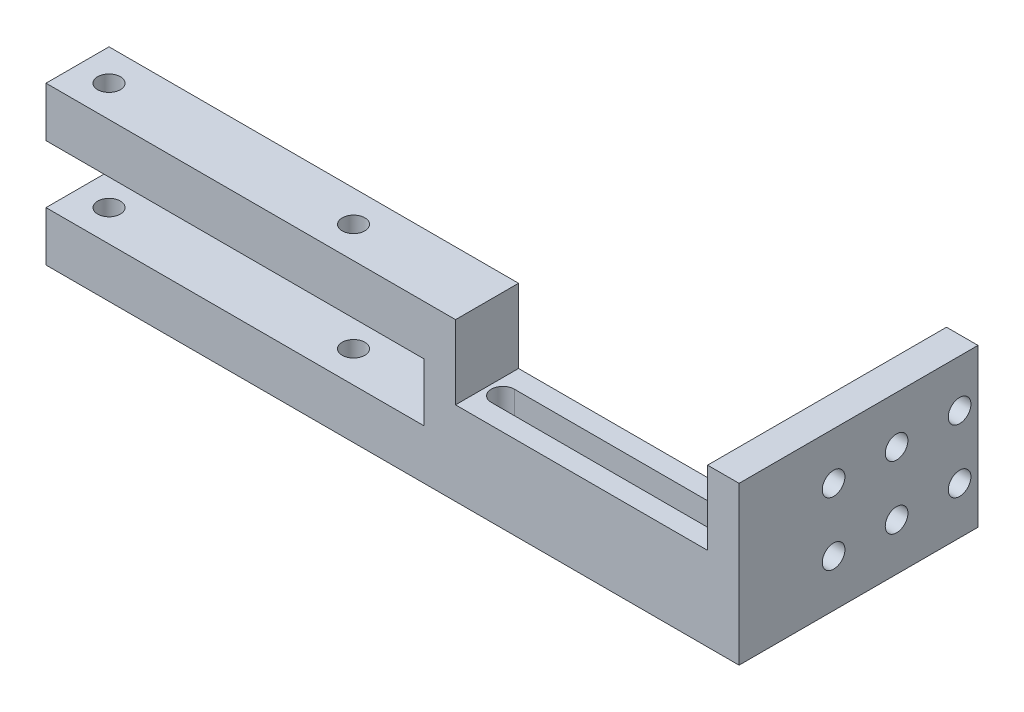
ISO-10303-21;
HEADER;
FILE_DESCRIPTION(('STEP AP214'),'2;1');
FILE_NAME('part.step','',(''),(''),'','','');
FILE_SCHEMA(('AUTOMOTIVE_DESIGN { 1 0 10303 214 1 1 1 1 }'));
ENDSEC;
DATA;
#1=APPLICATION_CONTEXT('core data for automotive mechanical design processes');
#2=APPLICATION_PROTOCOL_DEFINITION('international standard','automotive_design',2000,#1);
#3=PRODUCT_CONTEXT('',#1,'mechanical');
#4=PRODUCT('Part','Part','',(#3));
#5=PRODUCT_RELATED_PRODUCT_CATEGORY('part','',(#4));
#6=PRODUCT_DEFINITION_FORMATION('','',#4);
#7=PRODUCT_DEFINITION_CONTEXT('part definition',#1,'design');
#8=PRODUCT_DEFINITION('design','',#6,#7);
#9=PRODUCT_DEFINITION_SHAPE('','',#8);
#10=(LENGTH_UNIT() NAMED_UNIT(*) SI_UNIT(.MILLI.,.METRE.));
#11=(NAMED_UNIT(*) PLANE_ANGLE_UNIT() SI_UNIT($,.RADIAN.));
#12=(NAMED_UNIT(*) SI_UNIT($,.STERADIAN.) SOLID_ANGLE_UNIT());
#13=UNCERTAINTY_MEASURE_WITH_UNIT(LENGTH_MEASURE(1.E-05),#10,'distance_accuracy_value','');
#14=(GEOMETRIC_REPRESENTATION_CONTEXT(3) GLOBAL_UNCERTAINTY_ASSIGNED_CONTEXT((#13)) GLOBAL_UNIT_ASSIGNED_CONTEXT((#10,
#11,#12)) REPRESENTATION_CONTEXT('',''));
#15=CARTESIAN_POINT('',(0.,0.,0.));
#16=DIRECTION('',(0.,0.,1.));
#17=DIRECTION('',(1.,0.,0.));
#18=AXIS2_PLACEMENT_3D('',#15,#16,#17);
#19=CARTESIAN_POINT('',(0.,25.,0.));
#20=DIRECTION('',(0.,1.,0.));
#21=DIRECTION('',(0.,0.,1.));
#22=AXIS2_PLACEMENT_3D('',#19,#20,#21);
#23=PLANE('',#22);
#24=DIRECTION('',(0.,0.,1.));
#25=VECTOR('',#24,1.);
#26=CARTESIAN_POINT('',(105.,25.,-20.));
#27=LINE('',#26,#25);
#28=CARTESIAN_POINT('',(105.,25.,-37.9214797311));
#29=VERTEX_POINT('',#28);
#30=CARTESIAN_POINT('',(105.,25.,0.));
#31=VERTEX_POINT('',#30);
#32=EDGE_CURVE('E258',#29,#31,#27,.T.);
#33=ORIENTED_EDGE('',*,*,#32,.T.);
#34=DIRECTION('',(1.,0.,0.));
#35=VECTOR('',#34,1.);
#36=CARTESIAN_POINT('',(0.,25.,0.));
#37=LINE('',#36,#35);
#38=CARTESIAN_POINT('',(110.,25.,0.));
#39=VERTEX_POINT('',#38);
#40=EDGE_CURVE('E367',#31,#39,#37,.T.);
#41=ORIENTED_EDGE('',*,*,#40,.T.);
#42=DIRECTION('',(0.,0.,1.));
#43=VECTOR('',#42,1.);
#44=CARTESIAN_POINT('',(110.,25.,0.));
#45=LINE('',#44,#43);
#46=CARTESIAN_POINT('',(110.,25.,-37.9214797311));
#47=VERTEX_POINT('',#46);
#48=EDGE_CURVE('E331',#47,#39,#45,.T.);
#49=ORIENTED_EDGE('',*,*,#48,.F.);
#50=DIRECTION('',(1.,0.,0.));
#51=VECTOR('',#50,1.);
#52=CARTESIAN_POINT('',(0.,25.,-37.9214797311));
#53=LINE('',#52,#51);
#54=EDGE_CURVE('E214',#29,#47,#53,.T.);
#55=ORIENTED_EDGE('',*,*,#54,.F.);
#56=EDGE_LOOP('',(#33,#41,#49,#55));
#57=FACE_BOUND('',#56,.T.);
#58=ADVANCED_FACE('F34',(#57),#23,.T.);
#59=CARTESIAN_POINT('',(0.,25.,0.));
#60=DIRECTION('',(1.,0.,0.));
#61=DIRECTION('',(0.,0.,-1.));
#62=AXIS2_PLACEMENT_3D('',#59,#60,#61);
#63=PLANE('',#62);
#64=DIRECTION('',(0.,-1.,0.));
#65=VECTOR('',#64,1.);
#66=CARTESIAN_POINT('',(0.,25.,-10.));
#67=LINE('',#66,#65);
#68=CARTESIAN_POINT('',(0.,25.,-10.));
#69=VERTEX_POINT('',#68);
#70=CARTESIAN_POINT('',(0.,17.1,-10.));
#71=VERTEX_POINT('',#70);
#72=EDGE_CURVE('E11',#69,#71,#67,.T.);
#73=ORIENTED_EDGE('',*,*,#72,.T.);
#74=DIRECTION('',(0.,0.,-1.));
#75=VECTOR('',#74,1.);
#76=CARTESIAN_POINT('',(0.,17.1,-10.));
#77=LINE('',#76,#75);
#78=CARTESIAN_POINT('',(0.,17.1,0.));
#79=VERTEX_POINT('',#78);
#80=EDGE_CURVE('E374',#79,#71,#77,.T.);
#81=ORIENTED_EDGE('',*,*,#80,.F.);
#82=DIRECTION('',(0.,-1.,0.));
#83=VECTOR('',#82,1.);
#84=CARTESIAN_POINT('',(0.,25.,0.));
#85=LINE('',#84,#83);
#86=CARTESIAN_POINT('',(0.,25.,0.));
#87=VERTEX_POINT('',#86);
#88=EDGE_CURVE('E345',#87,#79,#85,.T.);
#89=ORIENTED_EDGE('',*,*,#88,.F.);
#90=DIRECTION('',(0.,0.,1.));
#91=VECTOR('',#90,1.);
#92=CARTESIAN_POINT('',(0.,25.,0.));
#93=LINE('',#92,#91);
#94=EDGE_CURVE('E342',#69,#87,#93,.T.);
#95=ORIENTED_EDGE('',*,*,#94,.F.);
#96=EDGE_LOOP('',(#73,#81,#89,#95));
#97=FACE_BOUND('',#96,.T.);
#98=ADVANCED_FACE('F290',(#97),#63,.F.);
#99=CARTESIAN_POINT('',(5.,25.,-5.));
#100=DIRECTION('',(0.,-1.,0.));
#101=DIRECTION('',(0.,0.,-1.));
#102=AXIS2_PLACEMENT_3D('',#99,#100,#101);
#103=CYLINDRICAL_SURFACE('',#102,1.8);
#104=CARTESIAN_POINT('',(5.,17.1,-5.));
#105=DIRECTION('',(0.,1.,0.));
#106=DIRECTION('',(0.,0.,1.));
#107=AXIS2_PLACEMENT_3D('',#104,#105,#106);
#108=CIRCLE('',#107,1.8);
#109=CARTESIAN_POINT('',(5.,17.1,-3.2));
#110=VERTEX_POINT('',#109);
#111=EDGE_CURVE('E366',#110,#110,#108,.T.);
#112=ORIENTED_EDGE('',*,*,#111,.F.);
#113=EDGE_LOOP('',(#112));
#114=FACE_BOUND('',#113,.T.);
#115=CARTESIAN_POINT('',(5.,25.,-5.));
#116=DIRECTION('',(0.,1.,0.));
#117=DIRECTION('',(0.,0.,1.));
#118=AXIS2_PLACEMENT_3D('',#115,#116,#117);
#119=CIRCLE('',#118,1.8);
#120=CARTESIAN_POINT('',(5.,25.,-3.2));
#121=VERTEX_POINT('',#120);
#122=EDGE_CURVE('E329',#121,#121,#119,.T.);
#123=ORIENTED_EDGE('',*,*,#122,.T.);
#124=EDGE_LOOP('',(#123));
#125=FACE_BOUND('',#124,.T.);
#126=ADVANCED_FACE('F299',(#114,#125),#103,.F.);
#127=CARTESIAN_POINT('',(43.81,25.,-5.));
#128=DIRECTION('',(0.,-1.,0.));
#129=DIRECTION('',(0.,0.,-1.));
#130=AXIS2_PLACEMENT_3D('',#127,#128,#129);
#131=CYLINDRICAL_SURFACE('',#130,1.8);
#132=CARTESIAN_POINT('',(43.81,17.1,-5.));
#133=DIRECTION('',(0.,1.,0.));
#134=DIRECTION('',(0.,0.,1.));
#135=AXIS2_PLACEMENT_3D('',#132,#133,#134);
#136=CIRCLE('',#135,1.8);
#137=CARTESIAN_POINT('',(43.81,17.1,-3.2));
#138=VERTEX_POINT('',#137);
#139=EDGE_CURVE('E412',#138,#138,#136,.T.);
#140=ORIENTED_EDGE('',*,*,#139,.F.);
#141=EDGE_LOOP('',(#140));
#142=FACE_BOUND('',#141,.T.);
#143=CARTESIAN_POINT('',(43.81,25.,-5.));
#144=DIRECTION('',(0.,1.,0.));
#145=DIRECTION('',(0.,0.,1.));
#146=AXIS2_PLACEMENT_3D('',#143,#144,#145);
#147=CIRCLE('',#146,1.8);
#148=CARTESIAN_POINT('',(43.81,25.,-3.2));
#149=VERTEX_POINT('',#148);
#150=EDGE_CURVE('E326',#149,#149,#147,.T.);
#151=ORIENTED_EDGE('',*,*,#150,.T.);
#152=EDGE_LOOP('',(#151));
#153=FACE_BOUND('',#152,.T.);
#154=ADVANCED_FACE('F420',(#142,#153),#131,.F.);
#155=CARTESIAN_POINT('',(110.,25.,0.));
#156=DIRECTION('',(1.,0.,0.));
#157=DIRECTION('',(0.,0.,-1.));
#158=AXIS2_PLACEMENT_3D('',#155,#156,#157);
#159=PLANE('',#158);
#160=DIRECTION('',(0.,-1.,0.));
#161=VECTOR('',#160,1.);
#162=CARTESIAN_POINT('',(110.,46.,-37.9214797311));
#163=LINE('',#162,#161);
#164=CARTESIAN_POINT('',(110.,0.,-37.9214797311));
#165=VERTEX_POINT('',#164);
#166=EDGE_CURVE('E210',#47,#165,#163,.T.);
#167=ORIENTED_EDGE('',*,*,#166,.F.);
#168=ORIENTED_EDGE('',*,*,#48,.T.);
#169=DIRECTION('',(0.,-1.,0.));
#170=VECTOR('',#169,1.);
#171=CARTESIAN_POINT('',(110.,25.,0.));
#172=LINE('',#171,#170);
#173=CARTESIAN_POINT('',(110.,0.,0.));
#174=VERTEX_POINT('',#173);
#175=EDGE_CURVE('E349',#39,#174,#172,.T.);
#176=ORIENTED_EDGE('',*,*,#175,.T.);
#177=DIRECTION('',(0.,0.,1.));
#178=VECTOR('',#177,1.);
#179=CARTESIAN_POINT('',(110.,0.,0.));
#180=LINE('',#179,#178);
#181=EDGE_CURVE('E359',#165,#174,#180,.T.);
#182=ORIENTED_EDGE('',*,*,#181,.F.);
#183=EDGE_LOOP('',(#167,#168,#176,#182));
#184=FACE_BOUND('',#183,.T.);
#185=CARTESIAN_POINT('',(110.,7.5,-25.));
#186=DIRECTION('',(1.,0.,0.));
#187=DIRECTION('',(0.,0.,-1.));
#188=AXIS2_PLACEMENT_3D('',#185,#186,#187);
#189=CIRCLE('',#188,1.8);
#190=CARTESIAN_POINT('',(110.,7.5,-26.8));
#191=VERTEX_POINT('',#190);
#192=EDGE_CURVE('E220',#191,#191,#189,.T.);
#193=ORIENTED_EDGE('',*,*,#192,.F.);
#194=EDGE_LOOP('',(#193));
#195=FACE_BOUND('',#194,.T.);
#196=CARTESIAN_POINT('',(110.,17.5,-25.));
#197=DIRECTION('',(1.,0.,0.));
#198=DIRECTION('',(0.,0.,-1.));
#199=AXIS2_PLACEMENT_3D('',#196,#197,#198);
#200=CIRCLE('',#199,1.8);
#201=CARTESIAN_POINT('',(110.,17.5,-26.8));
#202=VERTEX_POINT('',#201);
#203=EDGE_CURVE('E226',#202,#202,#200,.T.);
#204=ORIENTED_EDGE('',*,*,#203,.F.);
#205=EDGE_LOOP('',(#204));
#206=FACE_BOUND('',#205,.T.);
#207=CARTESIAN_POINT('',(110.,7.5,-35.));
#208=DIRECTION('',(1.,0.,0.));
#209=DIRECTION('',(0.,0.,-1.));
#210=AXIS2_PLACEMENT_3D('',#207,#208,#209);
#211=CIRCLE('',#210,1.8);
#212=CARTESIAN_POINT('',(110.,7.5,-36.8));
#213=VERTEX_POINT('',#212);
#214=EDGE_CURVE('E232',#213,#213,#211,.T.);
#215=ORIENTED_EDGE('',*,*,#214,.F.);
#216=EDGE_LOOP('',(#215));
#217=FACE_BOUND('',#216,.T.);
#218=CARTESIAN_POINT('',(110.,17.5,-35.));
#219=DIRECTION('',(1.,0.,0.));
#220=DIRECTION('',(0.,0.,-1.));
#221=AXIS2_PLACEMENT_3D('',#218,#219,#220);
#222=CIRCLE('',#221,1.8);
#223=CARTESIAN_POINT('',(110.,17.5,-36.8));
#224=VERTEX_POINT('',#223);
#225=EDGE_CURVE('E238',#224,#224,#222,.T.);
#226=ORIENTED_EDGE('',*,*,#225,.F.);
#227=EDGE_LOOP('',(#226));
#228=FACE_BOUND('',#227,.T.);
#229=CARTESIAN_POINT('',(110.,17.5,-15.));
#230=DIRECTION('',(1.,0.,0.));
#231=DIRECTION('',(0.,0.,-1.));
#232=AXIS2_PLACEMENT_3D('',#229,#230,#231);
#233=CIRCLE('',#232,1.8);
#234=CARTESIAN_POINT('',(110.,17.5,-16.8));
#235=VERTEX_POINT('',#234);
#236=EDGE_CURVE('E241',#235,#235,#233,.T.);
#237=ORIENTED_EDGE('',*,*,#236,.F.);
#238=EDGE_LOOP('',(#237));
#239=FACE_BOUND('',#238,.T.);
#240=CARTESIAN_POINT('',(110.,7.5,-15.));
#241=DIRECTION('',(1.,0.,0.));
#242=DIRECTION('',(0.,0.,-1.));
#243=AXIS2_PLACEMENT_3D('',#240,#241,#242);
#244=CIRCLE('',#243,1.8);
#245=CARTESIAN_POINT('',(110.,7.5,-16.8));
#246=VERTEX_POINT('',#245);
#247=EDGE_CURVE('E245',#246,#246,#244,.T.);
#248=ORIENTED_EDGE('',*,*,#247,.F.);
#249=EDGE_LOOP('',(#248));
#250=FACE_BOUND('',#249,.T.);
#251=ADVANCED_FACE('F425',(#184,#195,#206,#217,#228,#239,#250),#159,.T.);
#252=CARTESIAN_POINT('',(0.,25.,-10.));
#253=DIRECTION('',(0.,0.,-1.));
#254=DIRECTION('',(-1.,0.,0.));
#255=AXIS2_PLACEMENT_3D('',#252,#253,#254);
#256=PLANE('',#255);
#257=DIRECTION('',(0.,1.,0.));
#258=VECTOR('',#257,1.);
#259=CARTESIAN_POINT('',(65.,13.285,-9.99999999999999));
#260=LINE('',#259,#258);
#261=CARTESIAN_POINT('',(65.,13.285,-9.99999999999999));
#262=VERTEX_POINT('',#261);
#263=CARTESIAN_POINT('',(65.,25.,-9.99999999999999));
#264=VERTEX_POINT('',#263);
#265=EDGE_CURVE('E199',#262,#264,#260,.T.);
#266=ORIENTED_EDGE('',*,*,#265,.F.);
#267=DIRECTION('',(-1.,0.,0.));
#268=VECTOR('',#267,1.);
#269=CARTESIAN_POINT('',(105.,13.285,-10.));
#270=LINE('',#269,#268);
#271=CARTESIAN_POINT('',(105.,13.285,-10.));
#272=VERTEX_POINT('',#271);
#273=EDGE_CURVE('E190',#272,#262,#270,.T.);
#274=ORIENTED_EDGE('',*,*,#273,.F.);
#275=DIRECTION('',(0.,1.,0.));
#276=VECTOR('',#275,1.);
#277=CARTESIAN_POINT('',(105.,0.,-10.));
#278=LINE('',#277,#276);
#279=CARTESIAN_POINT('',(105.,0.,-10.));
#280=VERTEX_POINT('',#279);
#281=EDGE_CURVE('E254',#280,#272,#278,.T.);
#282=ORIENTED_EDGE('',*,*,#281,.F.);
#283=DIRECTION('',(1.,0.,0.));
#284=VECTOR('',#283,1.);
#285=CARTESIAN_POINT('',(0.,0.,-10.));
#286=LINE('',#285,#284);
#287=CARTESIAN_POINT('',(0.,0.,-10.));
#288=VERTEX_POINT('',#287);
#289=EDGE_CURVE('E259',#288,#280,#286,.T.);
#290=ORIENTED_EDGE('',*,*,#289,.F.);
#291=CARTESIAN_POINT('',(0.,7.9,-10.));
#292=VERTEX_POINT('',#291);
#293=EDGE_CURVE('E44',#292,#288,#67,.T.);
#294=ORIENTED_EDGE('',*,*,#293,.F.);
#295=DIRECTION('',(-1.,0.,0.));
#296=VECTOR('',#295,1.);
#297=CARTESIAN_POINT('',(60.,7.9,-10.));
#298=LINE('',#297,#296);
#299=CARTESIAN_POINT('',(60.,7.9,-10.));
#300=VERTEX_POINT('',#299);
#301=EDGE_CURVE('E407',#300,#292,#298,.T.);
#302=ORIENTED_EDGE('',*,*,#301,.F.);
#303=DIRECTION('',(0.,-1.,0.));
#304=VECTOR('',#303,1.);
#305=CARTESIAN_POINT('',(60.,7.9,-10.));
#306=LINE('',#305,#304);
#307=CARTESIAN_POINT('',(60.,17.1,-10.));
#308=VERTEX_POINT('',#307);
#309=EDGE_CURVE('E251',#308,#300,#306,.T.);
#310=ORIENTED_EDGE('',*,*,#309,.F.);
#311=DIRECTION('',(-1.,0.,0.));
#312=VECTOR('',#311,1.);
#313=CARTESIAN_POINT('',(60.,17.1,-10.));
#314=LINE('',#313,#312);
#315=EDGE_CURVE('E389',#308,#71,#314,.T.);
#316=ORIENTED_EDGE('',*,*,#315,.T.);
#317=ORIENTED_EDGE('',*,*,#72,.F.);
#318=DIRECTION('',(1.,0.,0.));
#319=VECTOR('',#318,1.);
#320=CARTESIAN_POINT('',(0.,25.,-10.));
#321=LINE('',#320,#319);
#322=EDGE_CURVE('E334',#69,#264,#321,.T.);
#323=ORIENTED_EDGE('',*,*,#322,.T.);
#324=EDGE_LOOP('',(#266,#274,#282,#290,#294,#302,#310,#316,#317,#323));
#325=FACE_BOUND('',#324,.T.);
#326=ADVANCED_FACE('F386',(#325),#256,.T.);
#327=CARTESIAN_POINT('',(0.,7.9,0.));
#328=VERTEX_POINT('',#327);
#329=CARTESIAN_POINT('',(0.,0.,0.));
#330=VERTEX_POINT('',#329);
#331=EDGE_CURVE('E348',#328,#330,#85,.T.);
#332=ORIENTED_EDGE('',*,*,#331,.F.);
#333=DIRECTION('',(0.,0.,1.));
#334=VECTOR('',#333,1.);
#335=CARTESIAN_POINT('',(0.,7.9,-10.));
#336=LINE('',#335,#334);
#337=EDGE_CURVE('E447',#292,#328,#336,.T.);
#338=ORIENTED_EDGE('',*,*,#337,.F.);
#339=ORIENTED_EDGE('',*,*,#293,.T.);
#340=DIRECTION('',(0.,0.,1.));
#341=VECTOR('',#340,1.);
#342=CARTESIAN_POINT('',(0.,0.,0.));
#343=LINE('',#342,#341);
#344=EDGE_CURVE('E355',#288,#330,#343,.T.);
#345=ORIENTED_EDGE('',*,*,#344,.T.);
#346=EDGE_LOOP('',(#332,#338,#339,#345));
#347=FACE_BOUND('',#346,.T.);
#348=ADVANCED_FACE('F302',(#347),#63,.F.);
#349=CARTESIAN_POINT('',(5.,7.9,-5.));
#350=DIRECTION('',(0.,-1.,0.));
#351=DIRECTION('',(0.,0.,-1.));
#352=AXIS2_PLACEMENT_3D('',#349,#350,#351);
#353=CIRCLE('',#352,1.8);
#354=CARTESIAN_POINT('',(5.,7.9,-6.8));
#355=VERTEX_POINT('',#354);
#356=EDGE_CURVE('E398',#355,#355,#353,.T.);
#357=ORIENTED_EDGE('',*,*,#356,.F.);
#358=EDGE_LOOP('',(#357));
#359=FACE_BOUND('',#358,.T.);
#360=CARTESIAN_POINT('',(5.,0.,-5.));
#361=DIRECTION('',(0.,1.,0.));
#362=DIRECTION('',(0.,0.,1.));
#363=AXIS2_PLACEMENT_3D('',#360,#361,#362);
#364=CIRCLE('',#363,1.8);
#365=CARTESIAN_POINT('',(5.,0.,-3.2));
#366=VERTEX_POINT('',#365);
#367=EDGE_CURVE('E361',#366,#366,#364,.T.);
#368=ORIENTED_EDGE('',*,*,#367,.F.);
#369=EDGE_LOOP('',(#368));
#370=FACE_BOUND('',#369,.T.);
#371=ADVANCED_FACE('F421',(#359,#370),#103,.F.);
#372=CARTESIAN_POINT('',(43.81,7.9,-5.));
#373=DIRECTION('',(0.,-1.,0.));
#374=DIRECTION('',(0.,0.,-1.));
#375=AXIS2_PLACEMENT_3D('',#372,#373,#374);
#376=CIRCLE('',#375,1.8);
#377=CARTESIAN_POINT('',(43.81,7.9,-6.8));
#378=VERTEX_POINT('',#377);
#379=EDGE_CURVE('E395',#378,#378,#376,.T.);
#380=ORIENTED_EDGE('',*,*,#379,.F.);
#381=EDGE_LOOP('',(#380));
#382=FACE_BOUND('',#381,.T.);
#383=CARTESIAN_POINT('',(43.81,0.,-5.));
#384=DIRECTION('',(0.,1.,0.));
#385=DIRECTION('',(0.,0.,1.));
#386=AXIS2_PLACEMENT_3D('',#383,#384,#385);
#387=CIRCLE('',#386,1.8);
#388=CARTESIAN_POINT('',(43.81,0.,-3.2));
#389=VERTEX_POINT('',#388);
#390=EDGE_CURVE('E364',#389,#389,#387,.T.);
#391=ORIENTED_EDGE('',*,*,#390,.F.);
#392=EDGE_LOOP('',(#391));
#393=FACE_BOUND('',#392,.T.);
#394=ADVANCED_FACE('F36',(#382,#393),#131,.F.);
#395=CARTESIAN_POINT('',(0.,25.,0.));
#396=DIRECTION('',(0.,0.,-1.));
#397=DIRECTION('',(-1.,0.,0.));
#398=AXIS2_PLACEMENT_3D('',#395,#396,#397);
#399=PLANE('',#398);
#400=ORIENTED_EDGE('',*,*,#40,.F.);
#401=DIRECTION('',(0.,1.,0.));
#402=VECTOR('',#401,1.);
#403=CARTESIAN_POINT('',(105.,13.285,0.));
#404=LINE('',#403,#402);
#405=CARTESIAN_POINT('',(105.,13.285,0.));
#406=VERTEX_POINT('',#405);
#407=EDGE_CURVE('E201',#406,#31,#404,.T.);
#408=ORIENTED_EDGE('',*,*,#407,.F.);
#409=DIRECTION('',(1.,0.,0.));
#410=VECTOR('',#409,1.);
#411=CARTESIAN_POINT('',(105.,13.285,0.));
#412=LINE('',#411,#410);
#413=CARTESIAN_POINT('',(65.,13.285,0.));
#414=VERTEX_POINT('',#413);
#415=EDGE_CURVE('E196',#414,#406,#412,.T.);
#416=ORIENTED_EDGE('',*,*,#415,.F.);
#417=DIRECTION('',(0.,1.,0.));
#418=VECTOR('',#417,1.);
#419=CARTESIAN_POINT('',(65.,13.285,0.));
#420=LINE('',#419,#418);
#421=CARTESIAN_POINT('',(65.,25.,0.));
#422=VERTEX_POINT('',#421);
#423=EDGE_CURVE('E205',#414,#422,#420,.T.);
#424=ORIENTED_EDGE('',*,*,#423,.T.);
#425=EDGE_CURVE('E352',#87,#422,#37,.T.);
#426=ORIENTED_EDGE('',*,*,#425,.F.);
#427=ORIENTED_EDGE('',*,*,#88,.T.);
#428=DIRECTION('',(-1.,0.,0.));
#429=VECTOR('',#428,1.);
#430=CARTESIAN_POINT('',(60.,17.1,0.));
#431=LINE('',#430,#429);
#432=CARTESIAN_POINT('',(60.,17.1,0.));
#433=VERTEX_POINT('',#432);
#434=EDGE_CURVE('E377',#433,#79,#431,.T.);
#435=ORIENTED_EDGE('',*,*,#434,.F.);
#436=DIRECTION('',(0.,1.,0.));
#437=VECTOR('',#436,1.);
#438=CARTESIAN_POINT('',(60.,7.9,0.));
#439=LINE('',#438,#437);
#440=CARTESIAN_POINT('',(60.,7.9,0.));
#441=VERTEX_POINT('',#440);
#442=EDGE_CURVE('E453',#441,#433,#439,.T.);
#443=ORIENTED_EDGE('',*,*,#442,.F.);
#444=DIRECTION('',(-1.,0.,0.));
#445=VECTOR('',#444,1.);
#446=CARTESIAN_POINT('',(60.,7.9,0.));
#447=LINE('',#446,#445);
#448=EDGE_CURVE('E400',#441,#328,#447,.T.);
#449=ORIENTED_EDGE('',*,*,#448,.T.);
#450=ORIENTED_EDGE('',*,*,#331,.T.);
#451=DIRECTION('',(1.,0.,0.));
#452=VECTOR('',#451,1.);
#453=CARTESIAN_POINT('',(0.,0.,0.));
#454=LINE('',#453,#452);
#455=EDGE_CURVE('E336',#330,#174,#454,.T.);
#456=ORIENTED_EDGE('',*,*,#455,.T.);
#457=ORIENTED_EDGE('',*,*,#175,.F.);
#458=EDGE_LOOP('',(#400,#408,#416,#424,#426,#427,#435,#443,#449,#450,#456,#457));
#459=FACE_BOUND('',#458,.T.);
#460=ADVANCED_FACE('F307',(#459),#399,.F.);
#461=DIRECTION('',(0.,0.,1.));
#462=VECTOR('',#461,1.);
#463=CARTESIAN_POINT('',(65.,25.,-9.99999999999999));
#464=LINE('',#463,#462);
#465=EDGE_CURVE('E186',#264,#422,#464,.T.);
#466=ORIENTED_EDGE('',*,*,#465,.F.);
#467=ORIENTED_EDGE('',*,*,#322,.F.);
#468=ORIENTED_EDGE('',*,*,#94,.T.);
#469=ORIENTED_EDGE('',*,*,#425,.T.);
#470=EDGE_LOOP('',(#466,#467,#468,#469));
#471=FACE_BOUND('',#470,.T.);
#472=ORIENTED_EDGE('',*,*,#150,.F.);
#473=EDGE_LOOP('',(#472));
#474=FACE_BOUND('',#473,.T.);
#475=ORIENTED_EDGE('',*,*,#122,.F.);
#476=EDGE_LOOP('',(#475));
#477=FACE_BOUND('',#476,.T.);
#478=ADVANCED_FACE('F293',(#471,#474,#477),#23,.T.);
#479=CARTESIAN_POINT('',(0.,0.,0.));
#480=DIRECTION('',(0.,1.,0.));
#481=DIRECTION('',(0.,0.,1.));
#482=AXIS2_PLACEMENT_3D('',#479,#480,#481);
#483=PLANE('',#482);
#484=DIRECTION('',(1.,0.,0.));
#485=VECTOR('',#484,1.);
#486=CARTESIAN_POINT('',(67.5,0.,-6.825));
#487=LINE('',#486,#485);
#488=CARTESIAN_POINT('',(67.5,0.,-6.825));
#489=VERTEX_POINT('',#488);
#490=CARTESIAN_POINT('',(102.5,0.,-6.82500000000001));
#491=VERTEX_POINT('',#490);
#492=EDGE_CURVE('E666',#489,#491,#487,.T.);
#493=ORIENTED_EDGE('',*,*,#492,.F.);
#494=CARTESIAN_POINT('',(67.5,0.,-5.));
#495=DIRECTION('',(0.,1.,0.));
#496=DIRECTION('',(0.,0.,1.));
#497=AXIS2_PLACEMENT_3D('',#494,#495,#496);
#498=CIRCLE('',#497,1.825);
#499=CARTESIAN_POINT('',(67.5,0.,-3.175));
#500=VERTEX_POINT('',#499);
#501=EDGE_CURVE('E187',#500,#489,#498,.F.);
#502=ORIENTED_EDGE('',*,*,#501,.F.);
#503=DIRECTION('',(-1.,0.,0.));
#504=VECTOR('',#503,1.);
#505=CARTESIAN_POINT('',(67.5,0.,-3.175));
#506=LINE('',#505,#504);
#507=CARTESIAN_POINT('',(102.5,0.,-3.17500000000001));
#508=VERTEX_POINT('',#507);
#509=EDGE_CURVE('E184',#508,#500,#506,.T.);
#510=ORIENTED_EDGE('',*,*,#509,.F.);
#511=CARTESIAN_POINT('',(102.5,0.,-5.00000000000001));
#512=DIRECTION('',(0.,1.,0.));
#513=DIRECTION('',(0.,0.,1.));
#514=AXIS2_PLACEMENT_3D('',#511,#512,#513);
#515=CIRCLE('',#514,1.825);
#516=EDGE_CURVE('E162',#491,#508,#515,.F.);
#517=ORIENTED_EDGE('',*,*,#516,.F.);
#518=EDGE_LOOP('',(#493,#502,#510,#517));
#519=FACE_BOUND('',#518,.T.);
#520=ORIENTED_EDGE('',*,*,#390,.T.);
#521=EDGE_LOOP('',(#520));
#522=FACE_BOUND('',#521,.T.);
#523=ORIENTED_EDGE('',*,*,#367,.T.);
#524=EDGE_LOOP('',(#523));
#525=FACE_BOUND('',#524,.T.);
#526=DIRECTION('',(0.,0.,1.));
#527=VECTOR('',#526,1.);
#528=CARTESIAN_POINT('',(105.,0.,-20.));
#529=LINE('',#528,#527);
#530=CARTESIAN_POINT('',(105.,0.,-37.9214797311));
#531=VERTEX_POINT('',#530);
#532=EDGE_CURVE('E38',#531,#280,#529,.T.);
#533=ORIENTED_EDGE('',*,*,#532,.F.);
#534=DIRECTION('',(-1.,0.,0.));
#535=VECTOR('',#534,1.);
#536=CARTESIAN_POINT('',(110.,0.,-37.9214797311));
#537=LINE('',#536,#535);
#538=EDGE_CURVE('E204',#165,#531,#537,.T.);
#539=ORIENTED_EDGE('',*,*,#538,.F.);
#540=ORIENTED_EDGE('',*,*,#181,.T.);
#541=ORIENTED_EDGE('',*,*,#455,.F.);
#542=ORIENTED_EDGE('',*,*,#344,.F.);
#543=ORIENTED_EDGE('',*,*,#289,.T.);
#544=EDGE_LOOP('',(#533,#539,#540,#541,#542,#543));
#545=FACE_BOUND('',#544,.T.);
#546=ADVANCED_FACE('F306',(#519,#522,#525,#545),#483,.F.);
#547=CARTESIAN_POINT('',(60.,17.1,-10.));
#548=DIRECTION('',(0.,1.,0.));
#549=DIRECTION('',(0.,0.,1.));
#550=AXIS2_PLACEMENT_3D('',#547,#548,#549);
#551=PLANE('',#550);
#552=ORIENTED_EDGE('',*,*,#111,.T.);
#553=EDGE_LOOP('',(#552));
#554=FACE_BOUND('',#553,.T.);
#555=ORIENTED_EDGE('',*,*,#139,.T.);
#556=EDGE_LOOP('',(#555));
#557=FACE_BOUND('',#556,.T.);
#558=ORIENTED_EDGE('',*,*,#80,.T.);
#559=ORIENTED_EDGE('',*,*,#315,.F.);
#560=DIRECTION('',(0.,0.,-1.));
#561=VECTOR('',#560,1.);
#562=CARTESIAN_POINT('',(60.,17.1,-10.));
#563=LINE('',#562,#561);
#564=EDGE_CURVE('E408',#433,#308,#563,.T.);
#565=ORIENTED_EDGE('',*,*,#564,.F.);
#566=ORIENTED_EDGE('',*,*,#434,.T.);
#567=EDGE_LOOP('',(#558,#559,#565,#566));
#568=FACE_BOUND('',#567,.T.);
#569=ADVANCED_FACE('F314',(#554,#557,#568),#551,.F.);
#570=CARTESIAN_POINT('',(60.,7.9,-10.));
#571=DIRECTION('',(0.,-1.,0.));
#572=DIRECTION('',(0.,0.,-1.));
#573=AXIS2_PLACEMENT_3D('',#570,#571,#572);
#574=PLANE('',#573);
#575=ORIENTED_EDGE('',*,*,#356,.T.);
#576=EDGE_LOOP('',(#575));
#577=FACE_BOUND('',#576,.T.);
#578=ORIENTED_EDGE('',*,*,#379,.T.);
#579=EDGE_LOOP('',(#578));
#580=FACE_BOUND('',#579,.T.);
#581=ORIENTED_EDGE('',*,*,#337,.T.);
#582=ORIENTED_EDGE('',*,*,#448,.F.);
#583=DIRECTION('',(0.,0.,1.));
#584=VECTOR('',#583,1.);
#585=CARTESIAN_POINT('',(60.,7.9,-10.));
#586=LINE('',#585,#584);
#587=EDGE_CURVE('E454',#300,#441,#586,.T.);
#588=ORIENTED_EDGE('',*,*,#587,.F.);
#589=ORIENTED_EDGE('',*,*,#301,.T.);
#590=EDGE_LOOP('',(#581,#582,#588,#589));
#591=FACE_BOUND('',#590,.T.);
#592=ADVANCED_FACE('F457',(#577,#580,#591),#574,.F.);
#593=CARTESIAN_POINT('',(60.,0.,0.));
#594=DIRECTION('',(1.,0.,0.));
#595=DIRECTION('',(0.,0.,-1.));
#596=AXIS2_PLACEMENT_3D('',#593,#594,#595);
#597=PLANE('',#596);
#598=ORIENTED_EDGE('',*,*,#309,.T.);
#599=ORIENTED_EDGE('',*,*,#587,.T.);
#600=ORIENTED_EDGE('',*,*,#442,.T.);
#601=ORIENTED_EDGE('',*,*,#564,.T.);
#602=EDGE_LOOP('',(#598,#599,#600,#601));
#603=FACE_BOUND('',#602,.T.);
#604=ADVANCED_FACE('F286',(#603),#597,.F.);
#605=CARTESIAN_POINT('',(105.,0.,-20.));
#606=DIRECTION('',(1.,0.,0.));
#607=DIRECTION('',(0.,0.,-1.));
#608=AXIS2_PLACEMENT_3D('',#605,#606,#607);
#609=PLANE('',#608);
#610=CARTESIAN_POINT('',(105.,7.5,-25.));
#611=DIRECTION('',(-1.,0.,0.));
#612=DIRECTION('',(0.,0.,1.));
#613=AXIS2_PLACEMENT_3D('',#610,#611,#612);
#614=CIRCLE('',#613,1.8);
#615=CARTESIAN_POINT('',(105.,7.5,-23.2));
#616=VERTEX_POINT('',#615);
#617=EDGE_CURVE('E217',#616,#616,#614,.T.);
#618=ORIENTED_EDGE('',*,*,#617,.F.);
#619=EDGE_LOOP('',(#618));
#620=FACE_BOUND('',#619,.T.);
#621=CARTESIAN_POINT('',(105.,17.5,-25.));
#622=DIRECTION('',(-1.,0.,0.));
#623=DIRECTION('',(0.,0.,1.));
#624=AXIS2_PLACEMENT_3D('',#621,#622,#623);
#625=CIRCLE('',#624,1.8);
#626=CARTESIAN_POINT('',(105.,17.5,-23.2));
#627=VERTEX_POINT('',#626);
#628=EDGE_CURVE('E223',#627,#627,#625,.T.);
#629=ORIENTED_EDGE('',*,*,#628,.F.);
#630=EDGE_LOOP('',(#629));
#631=FACE_BOUND('',#630,.T.);
#632=CARTESIAN_POINT('',(105.,7.5,-35.));
#633=DIRECTION('',(-1.,0.,0.));
#634=DIRECTION('',(0.,0.,1.));
#635=AXIS2_PLACEMENT_3D('',#632,#633,#634);
#636=CIRCLE('',#635,1.8);
#637=CARTESIAN_POINT('',(105.,7.5,-33.2));
#638=VERTEX_POINT('',#637);
#639=EDGE_CURVE('E229',#638,#638,#636,.T.);
#640=ORIENTED_EDGE('',*,*,#639,.F.);
#641=EDGE_LOOP('',(#640));
#642=FACE_BOUND('',#641,.T.);
#643=CARTESIAN_POINT('',(105.,17.5,-35.));
#644=DIRECTION('',(-1.,0.,0.));
#645=DIRECTION('',(0.,0.,1.));
#646=AXIS2_PLACEMENT_3D('',#643,#644,#645);
#647=CIRCLE('',#646,1.8);
#648=CARTESIAN_POINT('',(105.,17.5,-33.2));
#649=VERTEX_POINT('',#648);
#650=EDGE_CURVE('E235',#649,#649,#647,.T.);
#651=ORIENTED_EDGE('',*,*,#650,.F.);
#652=EDGE_LOOP('',(#651));
#653=FACE_BOUND('',#652,.T.);
#654=CARTESIAN_POINT('',(105.,17.5,-15.));
#655=DIRECTION('',(1.,0.,0.));
#656=DIRECTION('',(0.,0.,-1.));
#657=AXIS2_PLACEMENT_3D('',#654,#655,#656);
#658=CIRCLE('',#657,1.8);
#659=CARTESIAN_POINT('',(105.,17.5,-16.8));
#660=VERTEX_POINT('',#659);
#661=EDGE_CURVE('E244',#660,#660,#658,.T.);
#662=ORIENTED_EDGE('',*,*,#661,.T.);
#663=EDGE_LOOP('',(#662));
#664=FACE_BOUND('',#663,.T.);
#665=CARTESIAN_POINT('',(105.,7.5,-15.));
#666=DIRECTION('',(1.,0.,0.));
#667=DIRECTION('',(0.,0.,-1.));
#668=AXIS2_PLACEMENT_3D('',#665,#666,#667);
#669=CIRCLE('',#668,1.8);
#670=CARTESIAN_POINT('',(105.,7.5,-16.8));
#671=VERTEX_POINT('',#670);
#672=EDGE_CURVE('E248',#671,#671,#669,.T.);
#673=ORIENTED_EDGE('',*,*,#672,.T.);
#674=EDGE_LOOP('',(#673));
#675=FACE_BOUND('',#674,.T.);
#676=ORIENTED_EDGE('',*,*,#32,.F.);
#677=DIRECTION('',(0.,-1.,0.));
#678=VECTOR('',#677,1.);
#679=CARTESIAN_POINT('',(105.,46.,-37.9214797311));
#680=LINE('',#679,#678);
#681=EDGE_CURVE('E211',#29,#531,#680,.T.);
#682=ORIENTED_EDGE('',*,*,#681,.T.);
#683=ORIENTED_EDGE('',*,*,#532,.T.);
#684=ORIENTED_EDGE('',*,*,#281,.T.);
#685=DIRECTION('',(0.,0.,-1.));
#686=VECTOR('',#685,1.);
#687=CARTESIAN_POINT('',(105.,13.285,-10.));
#688=LINE('',#687,#686);
#689=EDGE_CURVE('E188',#406,#272,#688,.T.);
#690=ORIENTED_EDGE('',*,*,#689,.F.);
#691=ORIENTED_EDGE('',*,*,#407,.T.);
#692=EDGE_LOOP('',(#676,#682,#683,#684,#690,#691));
#693=FACE_BOUND('',#692,.T.);
#694=ADVANCED_FACE('F270',(#620,#631,#642,#653,#664,#675,#693),#609,.F.);
#695=CARTESIAN_POINT('',(100.,7.5,-15.));
#696=DIRECTION('',(1.,0.,0.));
#697=DIRECTION('',(0.,0.,-1.));
#698=AXIS2_PLACEMENT_3D('',#695,#696,#697);
#699=CYLINDRICAL_SURFACE('',#698,1.8);
#700=ORIENTED_EDGE('',*,*,#247,.T.);
#701=EDGE_LOOP('',(#700));
#702=FACE_BOUND('',#701,.T.);
#703=ORIENTED_EDGE('',*,*,#672,.F.);
#704=EDGE_LOOP('',(#703));
#705=FACE_BOUND('',#704,.T.);
#706=ADVANCED_FACE('F273',(#702,#705),#699,.F.);
#707=CARTESIAN_POINT('',(100.,17.5,-15.));
#708=DIRECTION('',(1.,0.,0.));
#709=DIRECTION('',(0.,0.,-1.));
#710=AXIS2_PLACEMENT_3D('',#707,#708,#709);
#711=CYLINDRICAL_SURFACE('',#710,1.8);
#712=ORIENTED_EDGE('',*,*,#236,.T.);
#713=EDGE_LOOP('',(#712));
#714=FACE_BOUND('',#713,.T.);
#715=ORIENTED_EDGE('',*,*,#661,.F.);
#716=EDGE_LOOP('',(#715));
#717=FACE_BOUND('',#716,.T.);
#718=ADVANCED_FACE('F275',(#714,#717),#711,.F.);
#719=CARTESIAN_POINT('',(117.,17.5,-35.));
#720=DIRECTION('',(-1.,0.,0.));
#721=DIRECTION('',(0.,0.,1.));
#722=AXIS2_PLACEMENT_3D('',#719,#720,#721);
#723=CYLINDRICAL_SURFACE('',#722,1.8);
#724=ORIENTED_EDGE('',*,*,#225,.T.);
#725=EDGE_LOOP('',(#724));
#726=FACE_BOUND('',#725,.T.);
#727=ORIENTED_EDGE('',*,*,#650,.T.);
#728=EDGE_LOOP('',(#727));
#729=FACE_BOUND('',#728,.T.);
#730=ADVANCED_FACE('F282',(#726,#729),#723,.F.);
#731=CARTESIAN_POINT('',(117.,7.5,-35.));
#732=DIRECTION('',(-1.,0.,0.));
#733=DIRECTION('',(0.,0.,1.));
#734=AXIS2_PLACEMENT_3D('',#731,#732,#733);
#735=CYLINDRICAL_SURFACE('',#734,1.8);
#736=ORIENTED_EDGE('',*,*,#214,.T.);
#737=EDGE_LOOP('',(#736));
#738=FACE_BOUND('',#737,.T.);
#739=ORIENTED_EDGE('',*,*,#639,.T.);
#740=EDGE_LOOP('',(#739));
#741=FACE_BOUND('',#740,.T.);
#742=ADVANCED_FACE('F483',(#738,#741),#735,.F.);
#743=CARTESIAN_POINT('',(117.,17.5,-25.));
#744=DIRECTION('',(-1.,0.,0.));
#745=DIRECTION('',(0.,0.,1.));
#746=AXIS2_PLACEMENT_3D('',#743,#744,#745);
#747=CYLINDRICAL_SURFACE('',#746,1.8);
#748=ORIENTED_EDGE('',*,*,#203,.T.);
#749=EDGE_LOOP('',(#748));
#750=FACE_BOUND('',#749,.T.);
#751=ORIENTED_EDGE('',*,*,#628,.T.);
#752=EDGE_LOOP('',(#751));
#753=FACE_BOUND('',#752,.T.);
#754=ADVANCED_FACE('F476',(#750,#753),#747,.F.);
#755=CARTESIAN_POINT('',(117.,7.5,-25.));
#756=DIRECTION('',(-1.,0.,0.));
#757=DIRECTION('',(0.,0.,1.));
#758=AXIS2_PLACEMENT_3D('',#755,#756,#757);
#759=CYLINDRICAL_SURFACE('',#758,1.8);
#760=ORIENTED_EDGE('',*,*,#192,.T.);
#761=EDGE_LOOP('',(#760));
#762=FACE_BOUND('',#761,.T.);
#763=ORIENTED_EDGE('',*,*,#617,.T.);
#764=EDGE_LOOP('',(#763));
#765=FACE_BOUND('',#764,.T.);
#766=ADVANCED_FACE('F469',(#762,#765),#759,.F.);
#767=CARTESIAN_POINT('',(110.,46.,-37.9214797311));
#768=DIRECTION('',(0.,0.,1.));
#769=DIRECTION('',(1.,0.,0.));
#770=AXIS2_PLACEMENT_3D('',#767,#768,#769);
#771=PLANE('',#770);
#772=ORIENTED_EDGE('',*,*,#54,.T.);
#773=ORIENTED_EDGE('',*,*,#166,.T.);
#774=ORIENTED_EDGE('',*,*,#538,.T.);
#775=ORIENTED_EDGE('',*,*,#681,.F.);
#776=EDGE_LOOP('',(#772,#773,#774,#775));
#777=FACE_BOUND('',#776,.T.);
#778=ADVANCED_FACE('F467',(#777),#771,.F.);
#779=CARTESIAN_POINT('',(65.,13.285,-9.99999999999999));
#780=DIRECTION('',(-1.,0.,0.));
#781=DIRECTION('',(0.,0.,1.));
#782=AXIS2_PLACEMENT_3D('',#779,#780,#781);
#783=PLANE('',#782);
#784=ORIENTED_EDGE('',*,*,#465,.T.);
#785=ORIENTED_EDGE('',*,*,#423,.F.);
#786=DIRECTION('',(0.,0.,1.));
#787=VECTOR('',#786,1.);
#788=CARTESIAN_POINT('',(65.,13.285,-9.99999999999999));
#789=LINE('',#788,#787);
#790=EDGE_CURVE('E193',#262,#414,#789,.T.);
#791=ORIENTED_EDGE('',*,*,#790,.F.);
#792=ORIENTED_EDGE('',*,*,#265,.T.);
#793=EDGE_LOOP('',(#784,#785,#791,#792));
#794=FACE_BOUND('',#793,.T.);
#795=ADVANCED_FACE('F381',(#794),#783,.F.);
#796=CARTESIAN_POINT('',(0.,13.285,0.));
#797=DIRECTION('',(0.,-1.,0.));
#798=DIRECTION('',(0.,0.,-1.));
#799=AXIS2_PLACEMENT_3D('',#796,#797,#798);
#800=PLANE('',#799);
#801=DIRECTION('',(1.,0.,0.));
#802=VECTOR('',#801,1.);
#803=CARTESIAN_POINT('',(67.5,13.285,-3.175));
#804=LINE('',#803,#802);
#805=CARTESIAN_POINT('',(67.5,13.285,-3.175));
#806=VERTEX_POINT('',#805);
#807=CARTESIAN_POINT('',(102.5,13.285,-3.17500000000001));
#808=VERTEX_POINT('',#807);
#809=EDGE_CURVE('E168',#806,#808,#804,.T.);
#810=ORIENTED_EDGE('',*,*,#809,.F.);
#811=CARTESIAN_POINT('',(67.5,13.285,-5.));
#812=DIRECTION('',(0.,1.,0.));
#813=DIRECTION('',(0.,0.,1.));
#814=AXIS2_PLACEMENT_3D('',#811,#812,#813);
#815=CIRCLE('',#814,1.825);
#816=CARTESIAN_POINT('',(67.5,13.285,-6.825));
#817=VERTEX_POINT('',#816);
#818=EDGE_CURVE('E60',#817,#806,#815,.T.);
#819=ORIENTED_EDGE('',*,*,#818,.F.);
#820=DIRECTION('',(-1.,0.,0.));
#821=VECTOR('',#820,1.);
#822=CARTESIAN_POINT('',(67.5,13.285,-6.825));
#823=LINE('',#822,#821);
#824=CARTESIAN_POINT('',(102.5,13.285,-6.82500000000001));
#825=VERTEX_POINT('',#824);
#826=EDGE_CURVE('E175',#825,#817,#823,.T.);
#827=ORIENTED_EDGE('',*,*,#826,.F.);
#828=CARTESIAN_POINT('',(102.5,13.285,-5.00000000000001));
#829=DIRECTION('',(0.,1.,0.));
#830=DIRECTION('',(0.,0.,1.));
#831=AXIS2_PLACEMENT_3D('',#828,#829,#830);
#832=CIRCLE('',#831,1.825);
#833=EDGE_CURVE('E159',#808,#825,#832,.T.);
#834=ORIENTED_EDGE('',*,*,#833,.F.);
#835=EDGE_LOOP('',(#810,#819,#827,#834));
#836=FACE_BOUND('',#835,.T.);
#837=ORIENTED_EDGE('',*,*,#689,.T.);
#838=ORIENTED_EDGE('',*,*,#273,.T.);
#839=ORIENTED_EDGE('',*,*,#790,.T.);
#840=ORIENTED_EDGE('',*,*,#415,.T.);
#841=EDGE_LOOP('',(#837,#838,#839,#840));
#842=FACE_BOUND('',#841,.T.);
#843=ADVANCED_FACE('F172',(#836,#842),#800,.F.);
#844=CARTESIAN_POINT('',(67.5,-38.8219654319562,-5.));
#845=DIRECTION('',(0.,1.,0.));
#846=DIRECTION('',(0.,0.,1.));
#847=AXIS2_PLACEMENT_3D('',#844,#845,#846);
#848=CYLINDRICAL_SURFACE('',#847,1.825);
#849=ORIENTED_EDGE('',*,*,#501,.T.);
#850=DIRECTION('',(0.,1.,0.));
#851=VECTOR('',#850,1.);
#852=CARTESIAN_POINT('',(67.5,-38.8219654319562,-6.825));
#853=LINE('',#852,#851);
#854=EDGE_CURVE('E180',#489,#817,#853,.T.);
#855=ORIENTED_EDGE('',*,*,#854,.T.);
#856=ORIENTED_EDGE('',*,*,#818,.T.);
#857=DIRECTION('',(0.,1.,0.));
#858=VECTOR('',#857,1.);
#859=CARTESIAN_POINT('',(67.5,-38.8219654319562,-3.175));
#860=LINE('',#859,#858);
#861=EDGE_CURVE('E165',#500,#806,#860,.T.);
#862=ORIENTED_EDGE('',*,*,#861,.F.);
#863=EDGE_LOOP('',(#849,#855,#856,#862));
#864=FACE_BOUND('',#863,.T.);
#865=ADVANCED_FACE('F626',(#864),#848,.F.);
#866=CARTESIAN_POINT('',(67.5,-38.8219654319562,-6.825));
#867=DIRECTION('',(0.,0.,-1.));
#868=DIRECTION('',(-1.,0.,0.));
#869=AXIS2_PLACEMENT_3D('',#866,#867,#868);
#870=PLANE('',#869);
#871=ORIENTED_EDGE('',*,*,#492,.T.);
#872=DIRECTION('',(0.,1.,0.));
#873=VECTOR('',#872,1.);
#874=CARTESIAN_POINT('',(102.5,-38.8219654319562,-6.82500000000001));
#875=LINE('',#874,#873);
#876=EDGE_CURVE('E164',#491,#825,#875,.T.);
#877=ORIENTED_EDGE('',*,*,#876,.T.);
#878=ORIENTED_EDGE('',*,*,#826,.T.);
#879=ORIENTED_EDGE('',*,*,#854,.F.);
#880=EDGE_LOOP('',(#871,#877,#878,#879));
#881=FACE_BOUND('',#880,.T.);
#882=ADVANCED_FACE('F633',(#881),#870,.F.);
#883=CARTESIAN_POINT('',(102.5,-38.8219654319562,-5.00000000000001));
#884=DIRECTION('',(0.,1.,0.));
#885=DIRECTION('',(0.,0.,1.));
#886=AXIS2_PLACEMENT_3D('',#883,#884,#885);
#887=CYLINDRICAL_SURFACE('',#886,1.825);
#888=ORIENTED_EDGE('',*,*,#516,.T.);
#889=DIRECTION('',(0.,1.,0.));
#890=VECTOR('',#889,1.);
#891=CARTESIAN_POINT('',(102.5,-38.8219654319562,-3.17500000000001));
#892=LINE('',#891,#890);
#893=EDGE_CURVE('E52',#508,#808,#892,.T.);
#894=ORIENTED_EDGE('',*,*,#893,.T.);
#895=ORIENTED_EDGE('',*,*,#833,.T.);
#896=ORIENTED_EDGE('',*,*,#876,.F.);
#897=EDGE_LOOP('',(#888,#894,#895,#896));
#898=FACE_BOUND('',#897,.T.);
#899=ADVANCED_FACE('F156',(#898),#887,.F.);
#900=CARTESIAN_POINT('',(67.5,-38.8219654319562,-3.175));
#901=DIRECTION('',(0.,0.,1.));
#902=DIRECTION('',(1.,0.,0.));
#903=AXIS2_PLACEMENT_3D('',#900,#901,#902);
#904=PLANE('',#903);
#905=ORIENTED_EDGE('',*,*,#509,.T.);
#906=ORIENTED_EDGE('',*,*,#861,.T.);
#907=ORIENTED_EDGE('',*,*,#809,.T.);
#908=ORIENTED_EDGE('',*,*,#893,.F.);
#909=EDGE_LOOP('',(#905,#906,#907,#908));
#910=FACE_BOUND('',#909,.T.);
#911=ADVANCED_FACE('F169',(#910),#904,.F.);
#912=CLOSED_SHELL('',(#58,#98,#126,#154,#251,#326,#348,#371,#394,#460,#478,#546,#569,#592,#604,
#694,#706,#718,#730,#742,#754,#766,#778,#795,#843,#865,#882,#899,#911));
#913=MANIFOLD_SOLID_BREP('B2',#912);
#914=ADVANCED_BREP_SHAPE_REPRESENTATION('',(#18,#913),#14);
#915=SHAPE_DEFINITION_REPRESENTATION(#9,#914);
ENDSEC;
END-ISO-10303-21;
